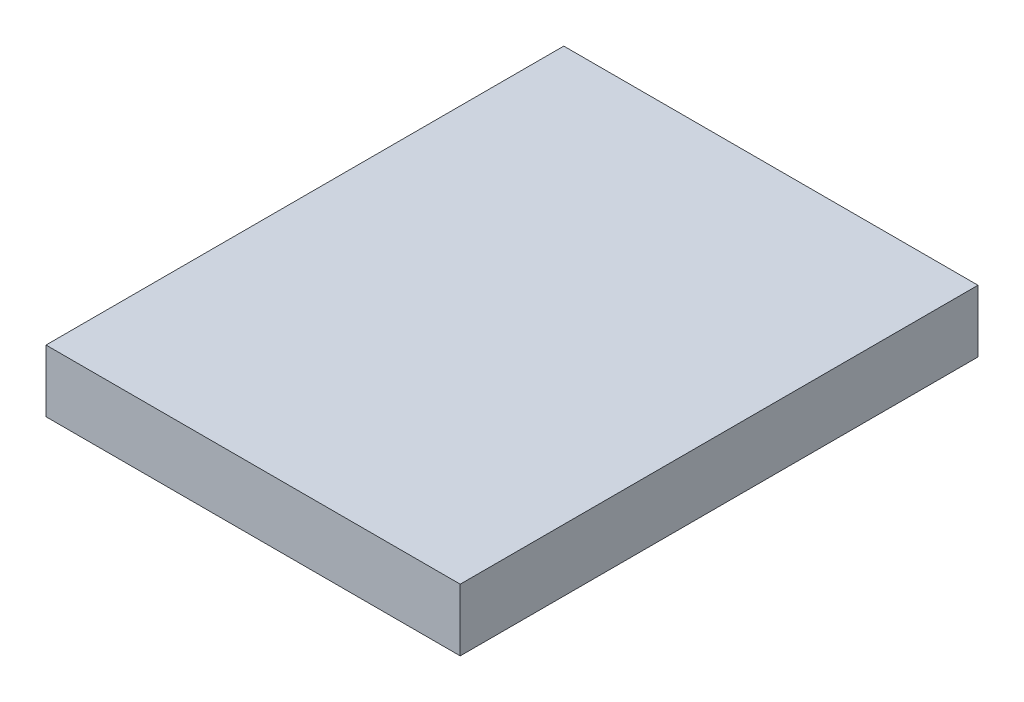
ISO-10303-21;
HEADER;
FILE_DESCRIPTION(('STEP AP214'),'2;1');
FILE_NAME('part.step','',(''),(''),'','','');
FILE_SCHEMA(('AUTOMOTIVE_DESIGN { 1 0 10303 214 1 1 1 1 }'));
ENDSEC;
DATA;
#1=APPLICATION_CONTEXT('core data for automotive mechanical design processes');
#2=APPLICATION_PROTOCOL_DEFINITION('international standard','automotive_design',2000,#1);
#3=PRODUCT_CONTEXT('',#1,'mechanical');
#4=PRODUCT('Part','Part','',(#3));
#5=PRODUCT_RELATED_PRODUCT_CATEGORY('part','',(#4));
#6=PRODUCT_DEFINITION_FORMATION('','',#4);
#7=PRODUCT_DEFINITION_CONTEXT('part definition',#1,'design');
#8=PRODUCT_DEFINITION('design','',#6,#7);
#9=PRODUCT_DEFINITION_SHAPE('','',#8);
#10=(LENGTH_UNIT() NAMED_UNIT(*) SI_UNIT(.MILLI.,.METRE.));
#11=(NAMED_UNIT(*) PLANE_ANGLE_UNIT() SI_UNIT($,.RADIAN.));
#12=(NAMED_UNIT(*) SI_UNIT($,.STERADIAN.) SOLID_ANGLE_UNIT());
#13=UNCERTAINTY_MEASURE_WITH_UNIT(LENGTH_MEASURE(1.E-05),#10,'distance_accuracy_value','');
#14=(GEOMETRIC_REPRESENTATION_CONTEXT(3) GLOBAL_UNCERTAINTY_ASSIGNED_CONTEXT((#13)) GLOBAL_UNIT_ASSIGNED_CONTEXT((#10,
#11,#12)) REPRESENTATION_CONTEXT('',''));
#15=CARTESIAN_POINT('',(0.,0.,0.));
#16=DIRECTION('',(0.,0.,1.));
#17=DIRECTION('',(1.,0.,0.));
#18=AXIS2_PLACEMENT_3D('',#15,#16,#17);
#19=CARTESIAN_POINT('',(-10.,3.,12.5));
#20=DIRECTION('',(1.,0.,0.));
#21=DIRECTION('',(0.,0.,-1.));
#22=AXIS2_PLACEMENT_3D('',#19,#20,#21);
#23=PLANE('',#22);
#24=DIRECTION('',(0.,0.,1.));
#25=VECTOR('',#24,1.);
#26=CARTESIAN_POINT('',(-10.,0.,12.5));
#27=LINE('',#26,#25);
#28=CARTESIAN_POINT('',(-10.,0.,-12.5));
#29=VERTEX_POINT('',#28);
#30=CARTESIAN_POINT('',(-10.,0.,12.5));
#31=VERTEX_POINT('',#30);
#32=EDGE_CURVE('E102',#29,#31,#27,.T.);
#33=ORIENTED_EDGE('',*,*,#32,.T.);
#34=DIRECTION('',(0.,-1.,0.));
#35=VECTOR('',#34,1.);
#36=CARTESIAN_POINT('',(-10.,3.,12.5));
#37=LINE('',#36,#35);
#38=CARTESIAN_POINT('',(-10.,3.,12.5));
#39=VERTEX_POINT('',#38);
#40=EDGE_CURVE('E11',#39,#31,#37,.T.);
#41=ORIENTED_EDGE('',*,*,#40,.F.);
#42=DIRECTION('',(0.,0.,1.));
#43=VECTOR('',#42,1.);
#44=CARTESIAN_POINT('',(-10.,3.,12.5));
#45=LINE('',#44,#43);
#46=CARTESIAN_POINT('',(-10.,3.,-12.5));
#47=VERTEX_POINT('',#46);
#48=EDGE_CURVE('E90',#47,#39,#45,.T.);
#49=ORIENTED_EDGE('',*,*,#48,.F.);
#50=DIRECTION('',(0.,-1.,0.));
#51=VECTOR('',#50,1.);
#52=CARTESIAN_POINT('',(-10.,3.,-12.5));
#53=LINE('',#52,#51);
#54=EDGE_CURVE('E98',#47,#29,#53,.T.);
#55=ORIENTED_EDGE('',*,*,#54,.T.);
#56=EDGE_LOOP('',(#33,#41,#49,#55));
#57=FACE_BOUND('',#56,.T.);
#58=ADVANCED_FACE('F39',(#57),#23,.F.);
#59=CARTESIAN_POINT('',(10.,3.,12.5));
#60=DIRECTION('',(0.,0.,-1.));
#61=DIRECTION('',(-1.,0.,0.));
#62=AXIS2_PLACEMENT_3D('',#59,#60,#61);
#63=PLANE('',#62);
#64=DIRECTION('',(1.,0.,0.));
#65=VECTOR('',#64,1.);
#66=CARTESIAN_POINT('',(10.,0.,12.5));
#67=LINE('',#66,#65);
#68=CARTESIAN_POINT('',(10.,0.,12.5));
#69=VERTEX_POINT('',#68);
#70=EDGE_CURVE('E94',#31,#69,#67,.T.);
#71=ORIENTED_EDGE('',*,*,#70,.T.);
#72=DIRECTION('',(0.,-1.,0.));
#73=VECTOR('',#72,1.);
#74=CARTESIAN_POINT('',(10.,3.,12.5));
#75=LINE('',#74,#73);
#76=CARTESIAN_POINT('',(10.,3.,12.5));
#77=VERTEX_POINT('',#76);
#78=EDGE_CURVE('E47',#77,#69,#75,.T.);
#79=ORIENTED_EDGE('',*,*,#78,.F.);
#80=DIRECTION('',(1.,0.,0.));
#81=VECTOR('',#80,1.);
#82=CARTESIAN_POINT('',(10.,3.,12.5));
#83=LINE('',#82,#81);
#84=EDGE_CURVE('E85',#39,#77,#83,.T.);
#85=ORIENTED_EDGE('',*,*,#84,.F.);
#86=ORIENTED_EDGE('',*,*,#40,.T.);
#87=EDGE_LOOP('',(#71,#79,#85,#86));
#88=FACE_BOUND('',#87,.T.);
#89=ADVANCED_FACE('F93',(#88),#63,.F.);
#90=CARTESIAN_POINT('',(10.,3.,12.5));
#91=DIRECTION('',(-1.,0.,0.));
#92=DIRECTION('',(0.,0.,1.));
#93=AXIS2_PLACEMENT_3D('',#90,#91,#92);
#94=PLANE('',#93);
#95=DIRECTION('',(0.,0.,-1.));
#96=VECTOR('',#95,1.);
#97=CARTESIAN_POINT('',(10.,0.,12.5));
#98=LINE('',#97,#96);
#99=CARTESIAN_POINT('',(10.,0.,-12.5));
#100=VERTEX_POINT('',#99);
#101=EDGE_CURVE('E72',#69,#100,#98,.T.);
#102=ORIENTED_EDGE('',*,*,#101,.T.);
#103=DIRECTION('',(0.,-1.,0.));
#104=VECTOR('',#103,1.);
#105=CARTESIAN_POINT('',(10.,3.,-12.5));
#106=LINE('',#105,#104);
#107=CARTESIAN_POINT('',(10.,3.,-12.5));
#108=VERTEX_POINT('',#107);
#109=EDGE_CURVE('E95',#108,#100,#106,.T.);
#110=ORIENTED_EDGE('',*,*,#109,.F.);
#111=DIRECTION('',(0.,0.,-1.));
#112=VECTOR('',#111,1.);
#113=CARTESIAN_POINT('',(10.,3.,12.5));
#114=LINE('',#113,#112);
#115=EDGE_CURVE('E88',#77,#108,#114,.T.);
#116=ORIENTED_EDGE('',*,*,#115,.F.);
#117=ORIENTED_EDGE('',*,*,#78,.T.);
#118=EDGE_LOOP('',(#102,#110,#116,#117));
#119=FACE_BOUND('',#118,.T.);
#120=ADVANCED_FACE('F96',(#119),#94,.F.);
#121=CARTESIAN_POINT('',(10.,3.,-12.5));
#122=DIRECTION('',(0.,0.,1.));
#123=DIRECTION('',(1.,0.,0.));
#124=AXIS2_PLACEMENT_3D('',#121,#122,#123);
#125=PLANE('',#124);
#126=DIRECTION('',(-1.,0.,0.));
#127=VECTOR('',#126,1.);
#128=CARTESIAN_POINT('',(10.,0.,-12.5));
#129=LINE('',#128,#127);
#130=EDGE_CURVE('E78',#100,#29,#129,.T.);
#131=ORIENTED_EDGE('',*,*,#130,.T.);
#132=ORIENTED_EDGE('',*,*,#54,.F.);
#133=DIRECTION('',(-1.,0.,0.));
#134=VECTOR('',#133,1.);
#135=CARTESIAN_POINT('',(10.,3.,-12.5));
#136=LINE('',#135,#134);
#137=EDGE_CURVE('E55',#108,#47,#136,.T.);
#138=ORIENTED_EDGE('',*,*,#137,.F.);
#139=ORIENTED_EDGE('',*,*,#109,.T.);
#140=EDGE_LOOP('',(#131,#132,#138,#139));
#141=FACE_BOUND('',#140,.T.);
#142=ADVANCED_FACE('F109',(#141),#125,.F.);
#143=CARTESIAN_POINT('',(0.,3.,0.));
#144=DIRECTION('',(0.,1.,0.));
#145=DIRECTION('',(0.,0.,1.));
#146=AXIS2_PLACEMENT_3D('',#143,#144,#145);
#147=PLANE('',#146);
#148=ORIENTED_EDGE('',*,*,#48,.T.);
#149=ORIENTED_EDGE('',*,*,#84,.T.);
#150=ORIENTED_EDGE('',*,*,#115,.T.);
#151=ORIENTED_EDGE('',*,*,#137,.T.);
#152=EDGE_LOOP('',(#148,#149,#150,#151));
#153=FACE_BOUND('',#152,.T.);
#154=ADVANCED_FACE('F86',(#153),#147,.T.);
#155=CARTESIAN_POINT('',(0.,0.,0.));
#156=DIRECTION('',(0.,1.,0.));
#157=DIRECTION('',(0.,0.,1.));
#158=AXIS2_PLACEMENT_3D('',#155,#156,#157);
#159=PLANE('',#158);
#160=ORIENTED_EDGE('',*,*,#32,.F.);
#161=ORIENTED_EDGE('',*,*,#130,.F.);
#162=ORIENTED_EDGE('',*,*,#101,.F.);
#163=ORIENTED_EDGE('',*,*,#70,.F.);
#164=EDGE_LOOP('',(#160,#161,#162,#163));
#165=FACE_BOUND('',#164,.T.);
#166=ADVANCED_FACE('F112',(#165),#159,.F.);
#167=CLOSED_SHELL('',(#58,#89,#120,#142,#154,#166));
#168=MANIFOLD_SOLID_BREP('B2',#167);
#169=ADVANCED_BREP_SHAPE_REPRESENTATION('',(#18,#168),#14);
#170=SHAPE_DEFINITION_REPRESENTATION(#9,#169);
ENDSEC;
END-ISO-10303-21;
